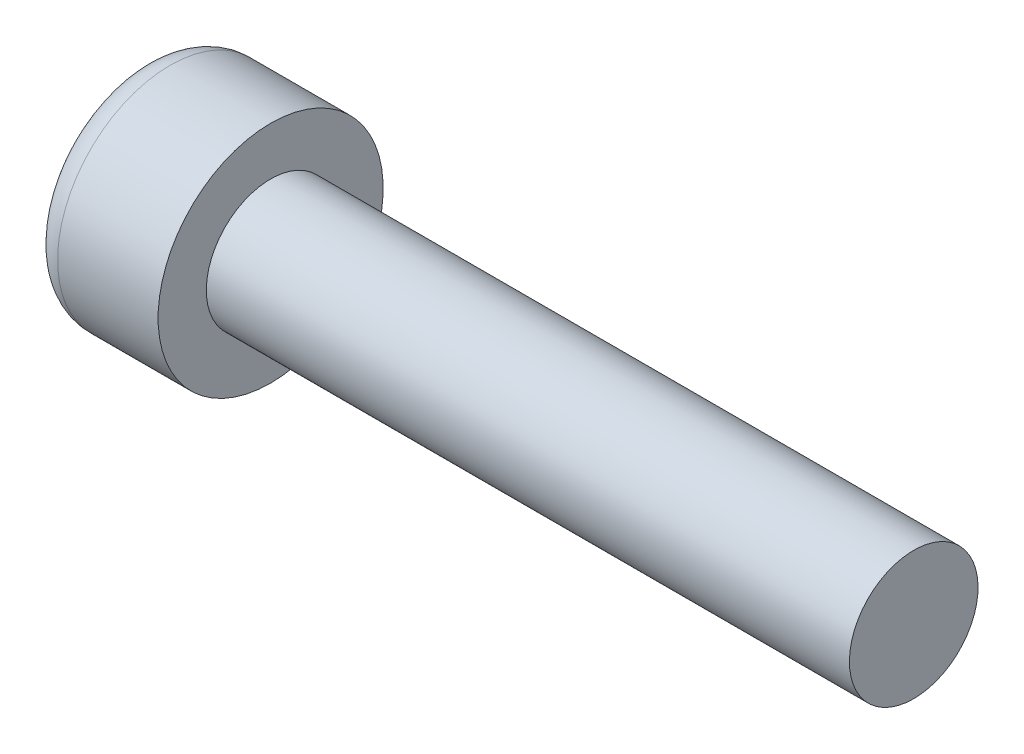
ISO-10303-21;
HEADER;
FILE_DESCRIPTION(('STEP AP214'),'2;1');
FILE_NAME('part.step','',(''),(''),'','','');
FILE_SCHEMA(('AUTOMOTIVE_DESIGN { 1 0 10303 214 1 1 1 1 }'));
ENDSEC;
DATA;
#1=APPLICATION_CONTEXT('core data for automotive mechanical design processes');
#2=APPLICATION_PROTOCOL_DEFINITION('international standard','automotive_design',2000,#1);
#3=PRODUCT_CONTEXT('',#1,'mechanical');
#4=PRODUCT('Part','Part','',(#3));
#5=PRODUCT_RELATED_PRODUCT_CATEGORY('part','',(#4));
#6=PRODUCT_DEFINITION_FORMATION('','',#4);
#7=PRODUCT_DEFINITION_CONTEXT('part definition',#1,'design');
#8=PRODUCT_DEFINITION('design','',#6,#7);
#9=PRODUCT_DEFINITION_SHAPE('','',#8);
#10=(LENGTH_UNIT() NAMED_UNIT(*) SI_UNIT(.MILLI.,.METRE.));
#11=(NAMED_UNIT(*) PLANE_ANGLE_UNIT() SI_UNIT($,.RADIAN.));
#12=(NAMED_UNIT(*) SI_UNIT($,.STERADIAN.) SOLID_ANGLE_UNIT());
#13=UNCERTAINTY_MEASURE_WITH_UNIT(LENGTH_MEASURE(1.E-05),#10,'distance_accuracy_value','');
#14=(GEOMETRIC_REPRESENTATION_CONTEXT(3) GLOBAL_UNCERTAINTY_ASSIGNED_CONTEXT((#13)) GLOBAL_UNIT_ASSIGNED_CONTEXT((#10,
#11,#12)) REPRESENTATION_CONTEXT('',''));
#15=CARTESIAN_POINT('',(0.,0.,0.));
#16=DIRECTION('',(0.,0.,1.));
#17=DIRECTION('',(1.,0.,0.));
#18=AXIS2_PLACEMENT_3D('',#15,#16,#17);
#19=CARTESIAN_POINT('',(0.,0.,0.));
#20=DIRECTION('',(1.,0.,0.));
#21=DIRECTION('',(0.,1.,0.));
#22=AXIS2_PLACEMENT_3D('',#19,#20,#21);
#23=PLANE('',#22);
#24=DIRECTION('',(0.,-0.5,-0.866025403784439));
#25=VECTOR('',#24,1.);
#26=CARTESIAN_POINT('',(0.,1.73205080756888,0.));
#27=LINE('',#26,#25);
#28=CARTESIAN_POINT('',(0.,1.73205080756888,0.));
#29=VERTEX_POINT('',#28);
#30=CARTESIAN_POINT('',(0.,0.866025403784439,-1.5));
#31=VERTEX_POINT('',#30);
#32=EDGE_CURVE('E123',#29,#31,#27,.T.);
#33=ORIENTED_EDGE('',*,*,#32,.F.);
#34=DIRECTION('',(0.,0.5,-0.866025403784439));
#35=VECTOR('',#34,1.);
#36=CARTESIAN_POINT('',(0.,0.866025403784439,1.5));
#37=LINE('',#36,#35);
#38=CARTESIAN_POINT('',(0.,0.866025403784439,1.5));
#39=VERTEX_POINT('',#38);
#40=EDGE_CURVE('E49',#39,#29,#37,.T.);
#41=ORIENTED_EDGE('',*,*,#40,.F.);
#42=DIRECTION('',(0.,1.,0.));
#43=VECTOR('',#42,1.);
#44=CARTESIAN_POINT('',(0.,-0.866025403784439,1.5));
#45=LINE('',#44,#43);
#46=CARTESIAN_POINT('',(0.,-0.866025403784439,1.5));
#47=VERTEX_POINT('',#46);
#48=EDGE_CURVE('E132',#47,#39,#45,.T.);
#49=ORIENTED_EDGE('',*,*,#48,.F.);
#50=DIRECTION('',(0.,0.5,0.866025403784439));
#51=VECTOR('',#50,1.);
#52=CARTESIAN_POINT('',(0.,-1.73205080756888,0.));
#53=LINE('',#52,#51);
#54=CARTESIAN_POINT('',(0.,-1.73205080756888,0.));
#55=VERTEX_POINT('',#54);
#56=EDGE_CURVE('E130',#55,#47,#53,.T.);
#57=ORIENTED_EDGE('',*,*,#56,.F.);
#58=DIRECTION('',(0.,-0.5,0.866025403784439));
#59=VECTOR('',#58,1.);
#60=CARTESIAN_POINT('',(0.,-0.866025403784439,-1.5));
#61=LINE('',#60,#59);
#62=CARTESIAN_POINT('',(0.,-0.866025403784439,-1.5));
#63=VERTEX_POINT('',#62);
#64=EDGE_CURVE('E97',#63,#55,#61,.T.);
#65=ORIENTED_EDGE('',*,*,#64,.F.);
#66=DIRECTION('',(0.,-1.,0.));
#67=VECTOR('',#66,1.);
#68=CARTESIAN_POINT('',(0.,0.866025403784439,-1.5));
#69=LINE('',#68,#67);
#70=EDGE_CURVE('E126',#31,#63,#69,.T.);
#71=ORIENTED_EDGE('',*,*,#70,.F.);
#72=EDGE_LOOP('',(#33,#41,#49,#57,#65,#71));
#73=FACE_BOUND('',#72,.T.);
#74=CARTESIAN_POINT('',(0.,0.,0.));
#75=DIRECTION('',(-1.,0.,0.));
#76=DIRECTION('',(0.,-1.,0.));
#77=AXIS2_PLACEMENT_3D('',#74,#75,#76);
#78=CIRCLE('',#77,2.625);
#79=CARTESIAN_POINT('',(0.,-2.625,0.));
#80=VERTEX_POINT('',#79);
#81=EDGE_CURVE('E11',#80,#80,#78,.T.);
#82=ORIENTED_EDGE('',*,*,#81,.T.);
#83=EDGE_LOOP('',(#82));
#84=FACE_BOUND('',#83,.T.);
#85=ADVANCED_FACE('F35',(#73,#84),#23,.F.);
#86=CARTESIAN_POINT('',(0.875,0.,0.));
#87=DIRECTION('',(-1.,0.,0.));
#88=DIRECTION('',(0.,-1.,0.));
#89=AXIS2_PLACEMENT_3D('',#86,#87,#88);
#90=TOROIDAL_SURFACE('',#89,2.625,0.875);
#91=ORIENTED_EDGE('',*,*,#81,.F.);
#92=EDGE_LOOP('',(#91));
#93=FACE_BOUND('',#92,.T.);
#94=CARTESIAN_POINT('',(0.875,0.,0.));
#95=DIRECTION('',(-1.,0.,0.));
#96=DIRECTION('',(0.,-1.,0.));
#97=AXIS2_PLACEMENT_3D('',#94,#95,#96);
#98=CIRCLE('',#97,3.5);
#99=CARTESIAN_POINT('',(0.875000000000001,-3.5,0.));
#100=VERTEX_POINT('',#99);
#101=EDGE_CURVE('E42',#100,#100,#98,.T.);
#102=ORIENTED_EDGE('',*,*,#101,.T.);
#103=EDGE_LOOP('',(#102));
#104=FACE_BOUND('',#103,.T.);
#105=ADVANCED_FACE('F152',(#93,#104),#90,.T.);
#106=CARTESIAN_POINT('',(0.,0.,0.));
#107=DIRECTION('',(-1.,0.,0.));
#108=DIRECTION('',(0.,-1.,0.));
#109=AXIS2_PLACEMENT_3D('',#106,#107,#108);
#110=CYLINDRICAL_SURFACE('',#109,3.5);
#111=ORIENTED_EDGE('',*,*,#101,.F.);
#112=EDGE_LOOP('',(#111));
#113=FACE_BOUND('',#112,.T.);
#114=CARTESIAN_POINT('',(4.,0.,0.));
#115=DIRECTION('',(-1.,0.,0.));
#116=DIRECTION('',(0.,-1.,0.));
#117=AXIS2_PLACEMENT_3D('',#114,#115,#116);
#118=CIRCLE('',#117,3.5);
#119=CARTESIAN_POINT('',(4.,-3.5,0.));
#120=VERTEX_POINT('',#119);
#121=EDGE_CURVE('E147',#120,#120,#118,.T.);
#122=ORIENTED_EDGE('',*,*,#121,.T.);
#123=EDGE_LOOP('',(#122));
#124=FACE_BOUND('',#123,.T.);
#125=ADVANCED_FACE('F154',(#113,#124),#110,.T.);
#126=CARTESIAN_POINT('',(4.,3.5,0.));
#127=DIRECTION('',(-1.,0.,0.));
#128=DIRECTION('',(0.,-1.,0.));
#129=AXIS2_PLACEMENT_3D('',#126,#127,#128);
#130=PLANE('',#129);
#131=ORIENTED_EDGE('',*,*,#121,.F.);
#132=EDGE_LOOP('',(#131));
#133=FACE_BOUND('',#132,.T.);
#134=CARTESIAN_POINT('',(4.,0.,0.));
#135=DIRECTION('',(-1.,0.,0.));
#136=DIRECTION('',(0.,-1.,0.));
#137=AXIS2_PLACEMENT_3D('',#134,#135,#136);
#138=CIRCLE('',#137,2.);
#139=CARTESIAN_POINT('',(4.,-2.,0.));
#140=VERTEX_POINT('',#139);
#141=EDGE_CURVE('E144',#140,#140,#138,.T.);
#142=ORIENTED_EDGE('',*,*,#141,.T.);
#143=EDGE_LOOP('',(#142));
#144=FACE_BOUND('',#143,.T.);
#145=ADVANCED_FACE('F157',(#133,#144),#130,.F.);
#146=CARTESIAN_POINT('',(0.,0.,0.));
#147=DIRECTION('',(-1.,0.,0.));
#148=DIRECTION('',(0.,-1.,0.));
#149=AXIS2_PLACEMENT_3D('',#146,#147,#148);
#150=CYLINDRICAL_SURFACE('',#149,2.);
#151=ORIENTED_EDGE('',*,*,#141,.F.);
#152=EDGE_LOOP('',(#151));
#153=FACE_BOUND('',#152,.T.);
#154=CARTESIAN_POINT('',(24.,0.,0.));
#155=DIRECTION('',(-1.,0.,0.));
#156=DIRECTION('',(0.,-1.,0.));
#157=AXIS2_PLACEMENT_3D('',#154,#155,#156);
#158=CIRCLE('',#157,1.99999999999999);
#159=CARTESIAN_POINT('',(24.,-1.99999999999999,0.));
#160=VERTEX_POINT('',#159);
#161=EDGE_CURVE('E136',#160,#160,#158,.T.);
#162=ORIENTED_EDGE('',*,*,#161,.T.);
#163=EDGE_LOOP('',(#162));
#164=FACE_BOUND('',#163,.T.);
#165=ADVANCED_FACE('F163',(#153,#164),#150,.T.);
#166=CARTESIAN_POINT('',(24.,2.,0.));
#167=DIRECTION('',(-1.,0.,0.));
#168=DIRECTION('',(0.,-1.,0.));
#169=AXIS2_PLACEMENT_3D('',#166,#167,#168);
#170=PLANE('',#169);
#171=ORIENTED_EDGE('',*,*,#161,.F.);
#172=EDGE_LOOP('',(#171));
#173=FACE_BOUND('',#172,.T.);
#174=ADVANCED_FACE('F169',(#173),#170,.F.);
#175=CARTESIAN_POINT('',(2.,0.866025403784439,1.5));
#176=DIRECTION('',(0.,0.866025403784439,0.5));
#177=DIRECTION('',(0.,-0.5,0.866025403784439));
#178=AXIS2_PLACEMENT_3D('',#175,#176,#177);
#179=PLANE('',#178);
#180=ORIENTED_EDGE('',*,*,#40,.T.);
#181=DIRECTION('',(-1.,0.,0.));
#182=VECTOR('',#181,1.);
#183=CARTESIAN_POINT('',(2.,1.73205080756888,0.));
#184=LINE('',#183,#182);
#185=CARTESIAN_POINT('',(2.,1.73205080756888,0.));
#186=VERTEX_POINT('',#185);
#187=EDGE_CURVE('E79',#186,#29,#184,.T.);
#188=ORIENTED_EDGE('',*,*,#187,.F.);
#189=DIRECTION('',(0.,0.5,-0.866025403784439));
#190=VECTOR('',#189,1.);
#191=CARTESIAN_POINT('',(2.,0.866025403784439,1.5));
#192=LINE('',#191,#190);
#193=CARTESIAN_POINT('',(2.,0.866025403784439,1.5));
#194=VERTEX_POINT('',#193);
#195=EDGE_CURVE('E134',#194,#186,#192,.T.);
#196=ORIENTED_EDGE('',*,*,#195,.F.);
#197=DIRECTION('',(-1.,0.,0.));
#198=VECTOR('',#197,1.);
#199=CARTESIAN_POINT('',(2.,0.866025403784439,1.5));
#200=LINE('',#199,#198);
#201=EDGE_CURVE('E57',#194,#39,#200,.T.);
#202=ORIENTED_EDGE('',*,*,#201,.T.);
#203=EDGE_LOOP('',(#180,#188,#196,#202));
#204=FACE_BOUND('',#203,.T.);
#205=ADVANCED_FACE('F174',(#204),#179,.F.);
#206=CARTESIAN_POINT('',(2.,-0.866025403784439,1.5));
#207=DIRECTION('',(0.,0.,1.));
#208=DIRECTION('',(0.,-1.,0.));
#209=AXIS2_PLACEMENT_3D('',#206,#207,#208);
#210=PLANE('',#209);
#211=ORIENTED_EDGE('',*,*,#48,.T.);
#212=ORIENTED_EDGE('',*,*,#201,.F.);
#213=DIRECTION('',(0.,1.,0.));
#214=VECTOR('',#213,1.);
#215=CARTESIAN_POINT('',(2.,-0.866025403784439,1.5));
#216=LINE('',#215,#214);
#217=CARTESIAN_POINT('',(2.,-0.866025403784439,1.5));
#218=VERTEX_POINT('',#217);
#219=EDGE_CURVE('E109',#218,#194,#216,.T.);
#220=ORIENTED_EDGE('',*,*,#219,.F.);
#221=DIRECTION('',(-1.,0.,0.));
#222=VECTOR('',#221,1.);
#223=CARTESIAN_POINT('',(2.,-0.866025403784439,1.5));
#224=LINE('',#223,#222);
#225=EDGE_CURVE('E101',#218,#47,#224,.T.);
#226=ORIENTED_EDGE('',*,*,#225,.T.);
#227=EDGE_LOOP('',(#211,#212,#220,#226));
#228=FACE_BOUND('',#227,.T.);
#229=ADVANCED_FACE('F179',(#228),#210,.F.);
#230=CARTESIAN_POINT('',(2.,-1.73205080756888,0.));
#231=DIRECTION('',(0.,-0.866025403784439,0.5));
#232=DIRECTION('',(0.,-0.5,-0.866025403784439));
#233=AXIS2_PLACEMENT_3D('',#230,#231,#232);
#234=PLANE('',#233);
#235=ORIENTED_EDGE('',*,*,#56,.T.);
#236=ORIENTED_EDGE('',*,*,#225,.F.);
#237=DIRECTION('',(0.,0.5,0.866025403784439));
#238=VECTOR('',#237,1.);
#239=CARTESIAN_POINT('',(2.,-1.73205080756888,0.));
#240=LINE('',#239,#238);
#241=CARTESIAN_POINT('',(2.,-1.73205080756888,0.));
#242=VERTEX_POINT('',#241);
#243=EDGE_CURVE('E105',#242,#218,#240,.T.);
#244=ORIENTED_EDGE('',*,*,#243,.F.);
#245=DIRECTION('',(-1.,0.,0.));
#246=VECTOR('',#245,1.);
#247=CARTESIAN_POINT('',(2.,-1.73205080756888,0.));
#248=LINE('',#247,#246);
#249=EDGE_CURVE('E90',#242,#55,#248,.T.);
#250=ORIENTED_EDGE('',*,*,#249,.T.);
#251=EDGE_LOOP('',(#235,#236,#244,#250));
#252=FACE_BOUND('',#251,.T.);
#253=ADVANCED_FACE('F106',(#252),#234,.F.);
#254=CARTESIAN_POINT('',(2.,-0.866025403784439,-1.5));
#255=DIRECTION('',(0.,-0.866025403784439,-0.5));
#256=DIRECTION('',(0.,0.5,-0.866025403784439));
#257=AXIS2_PLACEMENT_3D('',#254,#255,#256);
#258=PLANE('',#257);
#259=ORIENTED_EDGE('',*,*,#64,.T.);
#260=ORIENTED_EDGE('',*,*,#249,.F.);
#261=DIRECTION('',(0.,-0.5,0.866025403784439));
#262=VECTOR('',#261,1.);
#263=CARTESIAN_POINT('',(2.,-0.866025403784439,-1.5));
#264=LINE('',#263,#262);
#265=CARTESIAN_POINT('',(2.,-0.866025403784439,-1.5));
#266=VERTEX_POINT('',#265);
#267=EDGE_CURVE('E94',#266,#242,#264,.T.);
#268=ORIENTED_EDGE('',*,*,#267,.F.);
#269=DIRECTION('',(-1.,0.,0.));
#270=VECTOR('',#269,1.);
#271=CARTESIAN_POINT('',(2.,-0.866025403784439,-1.5));
#272=LINE('',#271,#270);
#273=EDGE_CURVE('E102',#266,#63,#272,.T.);
#274=ORIENTED_EDGE('',*,*,#273,.T.);
#275=EDGE_LOOP('',(#259,#260,#268,#274));
#276=FACE_BOUND('',#275,.T.);
#277=ADVANCED_FACE('F92',(#276),#258,.F.);
#278=CARTESIAN_POINT('',(2.,0.866025403784439,-1.5));
#279=DIRECTION('',(0.,0.,-1.));
#280=DIRECTION('',(-1.,0.,0.));
#281=AXIS2_PLACEMENT_3D('',#278,#279,#280);
#282=PLANE('',#281);
#283=ORIENTED_EDGE('',*,*,#70,.T.);
#284=ORIENTED_EDGE('',*,*,#273,.F.);
#285=DIRECTION('',(0.,-1.,0.));
#286=VECTOR('',#285,1.);
#287=CARTESIAN_POINT('',(2.,0.866025403784439,-1.5));
#288=LINE('',#287,#286);
#289=CARTESIAN_POINT('',(2.,0.866025403784439,-1.5));
#290=VERTEX_POINT('',#289);
#291=EDGE_CURVE('E115',#290,#266,#288,.T.);
#292=ORIENTED_EDGE('',*,*,#291,.F.);
#293=DIRECTION('',(-1.,0.,0.));
#294=VECTOR('',#293,1.);
#295=CARTESIAN_POINT('',(2.,0.866025403784439,-1.5));
#296=LINE('',#295,#294);
#297=EDGE_CURVE('E139',#290,#31,#296,.T.);
#298=ORIENTED_EDGE('',*,*,#297,.T.);
#299=EDGE_LOOP('',(#283,#284,#292,#298));
#300=FACE_BOUND('',#299,.T.);
#301=ADVANCED_FACE('F205',(#300),#282,.F.);
#302=CARTESIAN_POINT('',(2.,1.73205080756888,0.));
#303=DIRECTION('',(0.,0.866025403784439,-0.5));
#304=DIRECTION('',(0.,0.5,0.866025403784439));
#305=AXIS2_PLACEMENT_3D('',#302,#303,#304);
#306=PLANE('',#305);
#307=ORIENTED_EDGE('',*,*,#32,.T.);
#308=ORIENTED_EDGE('',*,*,#297,.F.);
#309=DIRECTION('',(0.,-0.5,-0.866025403784439));
#310=VECTOR('',#309,1.);
#311=CARTESIAN_POINT('',(2.,1.73205080756888,0.));
#312=LINE('',#311,#310);
#313=EDGE_CURVE('E117',#186,#290,#312,.T.);
#314=ORIENTED_EDGE('',*,*,#313,.F.);
#315=ORIENTED_EDGE('',*,*,#187,.T.);
#316=EDGE_LOOP('',(#307,#308,#314,#315));
#317=FACE_BOUND('',#316,.T.);
#318=ADVANCED_FACE('F193',(#317),#306,.F.);
#319=CARTESIAN_POINT('',(2.,0.,0.));
#320=DIRECTION('',(-1.,0.,0.));
#321=DIRECTION('',(0.,-1.,0.));
#322=AXIS2_PLACEMENT_3D('',#319,#320,#321);
#323=PLANE('',#322);
#324=ORIENTED_EDGE('',*,*,#195,.T.);
#325=ORIENTED_EDGE('',*,*,#313,.T.);
#326=ORIENTED_EDGE('',*,*,#291,.T.);
#327=ORIENTED_EDGE('',*,*,#267,.T.);
#328=ORIENTED_EDGE('',*,*,#243,.T.);
#329=ORIENTED_EDGE('',*,*,#219,.T.);
#330=EDGE_LOOP('',(#324,#325,#326,#327,#328,#329));
#331=FACE_BOUND('',#330,.T.);
#332=ADVANCED_FACE('F112',(#331),#323,.T.);
#333=CLOSED_SHELL('',(#85,#105,#125,#145,#165,#174,#205,#229,#253,#277,#301,#318,#332));
#334=MANIFOLD_SOLID_BREP('B2',#333);
#335=ADVANCED_BREP_SHAPE_REPRESENTATION('',(#18,#334),#14);
#336=SHAPE_DEFINITION_REPRESENTATION(#9,#335);
ENDSEC;
END-ISO-10303-21;
